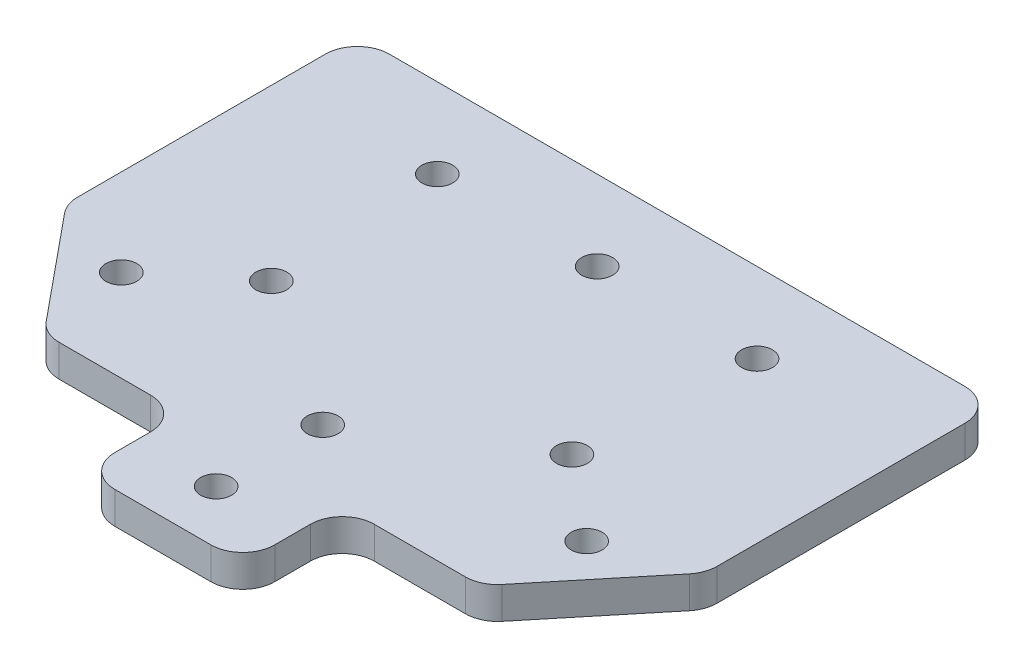
ISO-10303-21;
HEADER;
FILE_DESCRIPTION(('STEP AP214'),'2;1');
FILE_NAME('part.step','',(''),(''),'','','');
FILE_SCHEMA(('AUTOMOTIVE_DESIGN { 1 0 10303 214 1 1 1 1 }'));
ENDSEC;
DATA;
#1=APPLICATION_CONTEXT('core data for automotive mechanical design processes');
#2=APPLICATION_PROTOCOL_DEFINITION('international standard','automotive_design',2000,#1);
#3=PRODUCT_CONTEXT('',#1,'mechanical');
#4=PRODUCT('Part','Part','',(#3));
#5=PRODUCT_RELATED_PRODUCT_CATEGORY('part','',(#4));
#6=PRODUCT_DEFINITION_FORMATION('','',#4);
#7=PRODUCT_DEFINITION_CONTEXT('part definition',#1,'design');
#8=PRODUCT_DEFINITION('design','',#6,#7);
#9=PRODUCT_DEFINITION_SHAPE('','',#8);
#10=(LENGTH_UNIT() NAMED_UNIT(*) SI_UNIT(.MILLI.,.METRE.));
#11=(NAMED_UNIT(*) PLANE_ANGLE_UNIT() SI_UNIT($,.RADIAN.));
#12=(NAMED_UNIT(*) SI_UNIT($,.STERADIAN.) SOLID_ANGLE_UNIT());
#13=UNCERTAINTY_MEASURE_WITH_UNIT(LENGTH_MEASURE(1.E-05),#10,'distance_accuracy_value','');
#14=(GEOMETRIC_REPRESENTATION_CONTEXT(3) GLOBAL_UNCERTAINTY_ASSIGNED_CONTEXT((#13)) GLOBAL_UNIT_ASSIGNED_CONTEXT((#10,
#11,#12)) REPRESENTATION_CONTEXT('',''));
#15=CARTESIAN_POINT('',(0.,0.,0.));
#16=DIRECTION('',(0.,0.,1.));
#17=DIRECTION('',(1.,0.,0.));
#18=AXIS2_PLACEMENT_3D('',#15,#16,#17);
#19=CARTESIAN_POINT('',(0.,3.,0.));
#20=DIRECTION('',(0.,1.,0.));
#21=DIRECTION('',(0.,0.,1.));
#22=AXIS2_PLACEMENT_3D('',#19,#20,#21);
#23=PLANE('',#22);
#24=CARTESIAN_POINT('',(0.,3.,-131.748929431074));
#25=DIRECTION('',(0.,1.,0.));
#26=DIRECTION('',(0.,0.,1.));
#27=AXIS2_PLACEMENT_3D('',#24,#25,#26);
#28=CIRCLE('',#27,1.45);
#29=CARTESIAN_POINT('',(0.,3.,-130.298929431074));
#30=VERTEX_POINT('',#29);
#31=EDGE_CURVE('E536',#30,#30,#28,.T.);
#32=ORIENTED_EDGE('',*,*,#31,.F.);
#33=EDGE_LOOP('',(#32));
#34=FACE_BOUND('',#33,.T.);
#35=CARTESIAN_POINT('',(14.1030999850787,3.,-141.030854535507));
#36=DIRECTION('',(0.,1.,0.));
#37=DIRECTION('',(0.,0.,-1.));
#38=AXIS2_PLACEMENT_3D('',#35,#36,#37);
#39=CIRCLE('',#38,1.45000000000003);
#40=CARTESIAN_POINT('',(14.1030999850787,3.,-142.480854535507));
#41=VERTEX_POINT('',#40);
#42=EDGE_CURVE('E524',#41,#41,#39,.T.);
#43=ORIENTED_EDGE('',*,*,#42,.F.);
#44=EDGE_LOOP('',(#43));
#45=FACE_BOUND('',#44,.T.);
#46=CARTESIAN_POINT('',(-21.8303727123515,3.,-134.68347269743));
#47=DIRECTION('',(0.,1.,0.));
#48=DIRECTION('',(0.,0.,1.));
#49=AXIS2_PLACEMENT_3D('',#46,#47,#48);
#50=CIRCLE('',#49,1.45);
#51=CARTESIAN_POINT('',(-21.8303727123515,3.,-133.23347269743));
#52=VERTEX_POINT('',#51);
#53=EDGE_CURVE('E512',#52,#52,#50,.T.);
#54=ORIENTED_EDGE('',*,*,#53,.F.);
#55=EDGE_LOOP('',(#54));
#56=FACE_BOUND('',#55,.T.);
#57=CARTESIAN_POINT('',(-15.,3.,-157.5));
#58=DIRECTION('',(0.,1.,0.));
#59=DIRECTION('',(0.,0.,1.));
#60=AXIS2_PLACEMENT_3D('',#57,#58,#59);
#61=CIRCLE('',#60,1.45000000000001);
#62=CARTESIAN_POINT('',(-15.,3.,-156.05));
#63=VERTEX_POINT('',#62);
#64=EDGE_CURVE('E501',#63,#63,#61,.T.);
#65=ORIENTED_EDGE('',*,*,#64,.F.);
#66=EDGE_LOOP('',(#65));
#67=FACE_BOUND('',#66,.T.);
#68=DIRECTION('',(-1.,0.,0.));
#69=VECTOR('',#68,1.);
#70=CARTESIAN_POINT('',(30.,3.,-165.));
#71=LINE('',#70,#69);
#72=CARTESIAN_POINT('',(27.,3.,-165.));
#73=VERTEX_POINT('',#72);
#74=CARTESIAN_POINT('',(-27.,3.,-165.));
#75=VERTEX_POINT('',#74);
#76=EDGE_CURVE('E216',#73,#75,#71,.T.);
#77=ORIENTED_EDGE('',*,*,#76,.T.);
#78=CARTESIAN_POINT('',(-27.,3.,-162.));
#79=DIRECTION('',(0.,1.,0.));
#80=DIRECTION('',(0.,0.,1.));
#81=AXIS2_PLACEMENT_3D('',#78,#79,#80);
#82=CIRCLE('',#81,3.);
#83=CARTESIAN_POINT('',(-30.,3.,-162.));
#84=VERTEX_POINT('',#83);
#85=EDGE_CURVE('E269',#75,#84,#82,.T.);
#86=ORIENTED_EDGE('',*,*,#85,.T.);
#87=DIRECTION('',(0.,0.,1.));
#88=VECTOR('',#87,1.);
#89=CARTESIAN_POINT('',(-30.,3.,-165.));
#90=LINE('',#89,#88);
#91=CARTESIAN_POINT('',(-30.,3.,-138.752784037145));
#92=VERTEX_POINT('',#91);
#93=EDGE_CURVE('E199',#84,#92,#90,.T.);
#94=ORIENTED_EDGE('',*,*,#93,.T.);
#95=CARTESIAN_POINT('',(-27.,3.,-138.752784037145));
#96=DIRECTION('',(0.,1.,0.));
#97=DIRECTION('',(0.,0.,1.));
#98=AXIS2_PLACEMENT_3D('',#95,#96,#97);
#99=CIRCLE('',#98,3.);
#100=CARTESIAN_POINT('',(-29.3181818181818,3.,-136.848569485722));
#101=VERTEX_POINT('',#100);
#102=EDGE_CURVE('E256',#92,#101,#99,.T.);
#103=ORIENTED_EDGE('',*,*,#102,.T.);
#104=DIRECTION('',(0.63473818380768,0.,0.772727272727272));
#105=VECTOR('',#104,1.);
#106=CARTESIAN_POINT('',(-30.,3.,-137.678611726086));
#107=LINE('',#106,#105);
#108=CARTESIAN_POINT('',(-21.3790337746728,3.,-127.183488083754));
#109=VERTEX_POINT('',#108);
#110=EDGE_CURVE('E339',#101,#109,#107,.T.);
#111=ORIENTED_EDGE('',*,*,#110,.T.);
#112=CARTESIAN_POINT('',(-19.0608519564909,3.,-129.087702635177));
#113=DIRECTION('',(0.,1.,0.));
#114=DIRECTION('',(0.,0.,1.));
#115=AXIS2_PLACEMENT_3D('',#112,#113,#114);
#116=CIRCLE('',#115,3.);
#117=CARTESIAN_POINT('',(-19.0608519564909,3.,-126.087702635177));
#118=VERTEX_POINT('',#117);
#119=EDGE_CURVE('E258',#109,#118,#116,.T.);
#120=ORIENTED_EDGE('',*,*,#119,.T.);
#121=DIRECTION('',(1.,0.,0.));
#122=VECTOR('',#121,1.);
#123=CARTESIAN_POINT('',(-20.4789272428847,3.,-126.087702635177));
#124=LINE('',#123,#122);
#125=CARTESIAN_POINT('',(-10.5,3.,-126.087702635177));
#126=VERTEX_POINT('',#125);
#127=EDGE_CURVE('E330',#118,#126,#124,.T.);
#128=ORIENTED_EDGE('',*,*,#127,.T.);
#129=CARTESIAN_POINT('',(-10.5,3.,-123.087702635177));
#130=DIRECTION('',(0.,1.,0.));
#131=DIRECTION('',(0.,0.,1.));
#132=AXIS2_PLACEMENT_3D('',#129,#130,#131);
#133=CIRCLE('',#132,3.);
#134=CARTESIAN_POINT('',(-7.49999999999999,3.,-123.087702635177));
#135=VERTEX_POINT('',#134);
#136=EDGE_CURVE('E11',#126,#135,#133,.F.);
#137=ORIENTED_EDGE('',*,*,#136,.T.);
#138=DIRECTION('',(0.,0.,1.));
#139=VECTOR('',#138,1.);
#140=CARTESIAN_POINT('',(-7.49999999999999,3.,-126.087702635177));
#141=LINE('',#140,#139);
#142=CARTESIAN_POINT('',(-7.49999999999999,3.,-119.748929431074));
#143=VERTEX_POINT('',#142);
#144=EDGE_CURVE('E328',#135,#143,#141,.T.);
#145=ORIENTED_EDGE('',*,*,#144,.T.);
#146=CARTESIAN_POINT('',(-4.49999999999999,3.,-119.748929431074));
#147=DIRECTION('',(0.,1.,0.));
#148=DIRECTION('',(0.,0.,1.));
#149=AXIS2_PLACEMENT_3D('',#146,#147,#148);
#150=CIRCLE('',#149,3.);
#151=CARTESIAN_POINT('',(-4.5,3.,-116.748929431074));
#152=VERTEX_POINT('',#151);
#153=EDGE_CURVE('E260',#143,#152,#150,.T.);
#154=ORIENTED_EDGE('',*,*,#153,.T.);
#155=DIRECTION('',(1.,0.,0.));
#156=VECTOR('',#155,1.);
#157=CARTESIAN_POINT('',(-7.49999999999999,3.,-116.748929431074));
#158=LINE('',#157,#156);
#159=CARTESIAN_POINT('',(4.50000000000001,3.,-116.748929431074));
#160=VERTEX_POINT('',#159);
#161=EDGE_CURVE('E334',#152,#160,#158,.T.);
#162=ORIENTED_EDGE('',*,*,#161,.T.);
#163=CARTESIAN_POINT('',(4.50000000000001,3.,-119.748929431074));
#164=DIRECTION('',(0.,1.,0.));
#165=DIRECTION('',(0.,0.,1.));
#166=AXIS2_PLACEMENT_3D('',#163,#164,#165);
#167=CIRCLE('',#166,3.);
#168=CARTESIAN_POINT('',(7.50000000000001,3.,-119.748929431074));
#169=VERTEX_POINT('',#168);
#170=EDGE_CURVE('E262',#160,#169,#167,.T.);
#171=ORIENTED_EDGE('',*,*,#170,.T.);
#172=DIRECTION('',(0.,0.,-1.));
#173=VECTOR('',#172,1.);
#174=CARTESIAN_POINT('',(7.50000000000001,3.,-116.748929431074));
#175=LINE('',#174,#173);
#176=CARTESIAN_POINT('',(7.50000000000001,3.,-123.087702635177));
#177=VERTEX_POINT('',#176);
#178=EDGE_CURVE('E337',#169,#177,#175,.T.);
#179=ORIENTED_EDGE('',*,*,#178,.T.);
#180=CARTESIAN_POINT('',(10.5,3.,-123.087702635177));
#181=DIRECTION('',(0.,1.,0.));
#182=DIRECTION('',(0.,0.,1.));
#183=AXIS2_PLACEMENT_3D('',#180,#181,#182);
#184=CIRCLE('',#183,3.);
#185=CARTESIAN_POINT('',(10.5,3.,-126.087702635177));
#186=VERTEX_POINT('',#185);
#187=EDGE_CURVE('E312',#177,#186,#184,.F.);
#188=ORIENTED_EDGE('',*,*,#187,.T.);
#189=DIRECTION('',(1.,0.,0.));
#190=VECTOR('',#189,1.);
#191=CARTESIAN_POINT('',(7.50000000000001,3.,-126.087702635177));
#192=LINE('',#191,#190);
#193=CARTESIAN_POINT('',(19.060851956491,3.,-126.087702635177));
#194=VERTEX_POINT('',#193);
#195=EDGE_CURVE('E345',#186,#194,#192,.T.);
#196=ORIENTED_EDGE('',*,*,#195,.T.);
#197=CARTESIAN_POINT('',(19.060851956491,3.,-129.087702635177));
#198=DIRECTION('',(0.,1.,0.));
#199=DIRECTION('',(0.,0.,1.));
#200=AXIS2_PLACEMENT_3D('',#197,#198,#199);
#201=CIRCLE('',#200,3.);
#202=CARTESIAN_POINT('',(21.3790337746728,3.,-127.183488083754));
#203=VERTEX_POINT('',#202);
#204=EDGE_CURVE('E264',#194,#203,#201,.T.);
#205=ORIENTED_EDGE('',*,*,#204,.T.);
#206=DIRECTION('',(0.63473818380768,0.,-0.772727272727272));
#207=VECTOR('',#206,1.);
#208=CARTESIAN_POINT('',(20.4789272428847,3.,-126.087702635177));
#209=LINE('',#208,#207);
#210=CARTESIAN_POINT('',(29.3181818181818,3.,-136.848569485722));
#211=VERTEX_POINT('',#210);
#212=EDGE_CURVE('E348',#203,#211,#209,.T.);
#213=ORIENTED_EDGE('',*,*,#212,.T.);
#214=CARTESIAN_POINT('',(27.,3.,-138.752784037145));
#215=DIRECTION('',(0.,1.,0.));
#216=DIRECTION('',(0.,0.,1.));
#217=AXIS2_PLACEMENT_3D('',#214,#215,#216);
#218=CIRCLE('',#217,3.);
#219=CARTESIAN_POINT('',(30.,3.,-138.752784037145));
#220=VERTEX_POINT('',#219);
#221=EDGE_CURVE('E63',#211,#220,#218,.T.);
#222=ORIENTED_EDGE('',*,*,#221,.T.);
#223=DIRECTION('',(0.,0.,-1.));
#224=VECTOR('',#223,1.);
#225=CARTESIAN_POINT('',(30.,3.,-137.678611726086));
#226=LINE('',#225,#224);
#227=CARTESIAN_POINT('',(30.,3.,-162.));
#228=VERTEX_POINT('',#227);
#229=EDGE_CURVE('E349',#220,#228,#226,.T.);
#230=ORIENTED_EDGE('',*,*,#229,.T.);
#231=CARTESIAN_POINT('',(27.,3.,-162.));
#232=DIRECTION('',(0.,1.,0.));
#233=DIRECTION('',(0.,0.,1.));
#234=AXIS2_PLACEMENT_3D('',#231,#232,#233);
#235=CIRCLE('',#234,3.);
#236=EDGE_CURVE('E267',#228,#73,#235,.T.);
#237=ORIENTED_EDGE('',*,*,#236,.T.);
#238=EDGE_LOOP('',(#77,#86,#94,#103,#111,#120,#128,#137,#145,#154,#162,#171,#179,#188,#196,#205,
#213,#222,#230,#237));
#239=FACE_BOUND('',#238,.T.);
#240=CARTESIAN_POINT('',(0.,3.,-157.5));
#241=DIRECTION('',(0.,1.,0.));
#242=DIRECTION('',(0.,0.,1.));
#243=AXIS2_PLACEMENT_3D('',#240,#241,#242);
#244=CIRCLE('',#243,1.45000000000001);
#245=CARTESIAN_POINT('',(0.,3.,-156.05));
#246=VERTEX_POINT('',#245);
#247=EDGE_CURVE('E207',#246,#246,#244,.T.);
#248=ORIENTED_EDGE('',*,*,#247,.F.);
#249=EDGE_LOOP('',(#248));
#250=FACE_BOUND('',#249,.T.);
#251=CARTESIAN_POINT('',(-14.1030999850787,3.,-141.030854535507));
#252=DIRECTION('',(0.,1.,0.));
#253=DIRECTION('',(0.,0.,1.));
#254=AXIS2_PLACEMENT_3D('',#251,#252,#253);
#255=CIRCLE('',#254,1.45000000000002);
#256=CARTESIAN_POINT('',(-14.1030999850787,3.,-139.580854535507));
#257=VERTEX_POINT('',#256);
#258=EDGE_CURVE('E506',#257,#257,#255,.T.);
#259=ORIENTED_EDGE('',*,*,#258,.F.);
#260=EDGE_LOOP('',(#259));
#261=FACE_BOUND('',#260,.T.);
#262=CARTESIAN_POINT('',(21.8303727123515,3.,-134.68347269743));
#263=DIRECTION('',(0.,1.,0.));
#264=DIRECTION('',(0.,0.,-1.));
#265=AXIS2_PLACEMENT_3D('',#262,#263,#264);
#266=CIRCLE('',#265,1.45000000000002);
#267=CARTESIAN_POINT('',(21.8303727123515,3.,-136.13347269743));
#268=VERTEX_POINT('',#267);
#269=EDGE_CURVE('E518',#268,#268,#266,.T.);
#270=ORIENTED_EDGE('',*,*,#269,.F.);
#271=EDGE_LOOP('',(#270));
#272=FACE_BOUND('',#271,.T.);
#273=CARTESIAN_POINT('',(15.,3.,-157.5));
#274=DIRECTION('',(0.,1.,0.));
#275=DIRECTION('',(0.,0.,-1.));
#276=AXIS2_PLACEMENT_3D('',#273,#274,#275);
#277=CIRCLE('',#276,1.45000000000001);
#278=CARTESIAN_POINT('',(15.,3.,-158.95));
#279=VERTEX_POINT('',#278);
#280=EDGE_CURVE('E530',#279,#279,#277,.T.);
#281=ORIENTED_EDGE('',*,*,#280,.F.);
#282=EDGE_LOOP('',(#281));
#283=FACE_BOUND('',#282,.T.);
#284=CARTESIAN_POINT('',(0.,3.,-121.748929431074));
#285=DIRECTION('',(0.,1.,0.));
#286=DIRECTION('',(0.,0.,1.));
#287=AXIS2_PLACEMENT_3D('',#284,#285,#286);
#288=CIRCLE('',#287,1.45000000000001);
#289=CARTESIAN_POINT('',(0.,3.,-120.298929431074));
#290=VERTEX_POINT('',#289);
#291=EDGE_CURVE('E542',#290,#290,#288,.T.);
#292=ORIENTED_EDGE('',*,*,#291,.F.);
#293=EDGE_LOOP('',(#292));
#294=FACE_BOUND('',#293,.T.);
#295=ADVANCED_FACE('F41',(#34,#45,#56,#67,#239,#250,#261,#272,#283,#294),#23,.T.);
#296=CARTESIAN_POINT('',(0.,0.,0.));
#297=DIRECTION('',(0.,1.,0.));
#298=DIRECTION('',(0.,0.,1.));
#299=AXIS2_PLACEMENT_3D('',#296,#297,#298);
#300=PLANE('',#299);
#301=DIRECTION('',(0.,0.,1.));
#302=VECTOR('',#301,1.);
#303=CARTESIAN_POINT('',(-30.,0.,-165.));
#304=LINE('',#303,#302);
#305=CARTESIAN_POINT('',(-30.,0.,-162.));
#306=VERTEX_POINT('',#305);
#307=CARTESIAN_POINT('',(-30.,0.,-138.752784037145));
#308=VERTEX_POINT('',#307);
#309=EDGE_CURVE('E196',#306,#308,#304,.T.);
#310=ORIENTED_EDGE('',*,*,#309,.F.);
#311=CARTESIAN_POINT('',(-27.,0.,-162.));
#312=DIRECTION('',(0.,1.,0.));
#313=DIRECTION('',(0.,0.,1.));
#314=AXIS2_PLACEMENT_3D('',#311,#312,#313);
#315=CIRCLE('',#314,3.);
#316=CARTESIAN_POINT('',(-27.,0.,-165.));
#317=VERTEX_POINT('',#316);
#318=EDGE_CURVE('E179',#306,#317,#315,.F.);
#319=ORIENTED_EDGE('',*,*,#318,.T.);
#320=DIRECTION('',(-1.,0.,0.));
#321=VECTOR('',#320,1.);
#322=CARTESIAN_POINT('',(30.,0.,-165.));
#323=LINE('',#322,#321);
#324=CARTESIAN_POINT('',(27.,0.,-165.));
#325=VERTEX_POINT('',#324);
#326=EDGE_CURVE('E238',#325,#317,#323,.T.);
#327=ORIENTED_EDGE('',*,*,#326,.F.);
#328=CARTESIAN_POINT('',(27.,0.,-162.));
#329=DIRECTION('',(0.,1.,0.));
#330=DIRECTION('',(0.,0.,1.));
#331=AXIS2_PLACEMENT_3D('',#328,#329,#330);
#332=CIRCLE('',#331,3.);
#333=CARTESIAN_POINT('',(30.,0.,-162.));
#334=VERTEX_POINT('',#333);
#335=EDGE_CURVE('E190',#325,#334,#332,.F.);
#336=ORIENTED_EDGE('',*,*,#335,.T.);
#337=DIRECTION('',(0.,0.,-1.));
#338=VECTOR('',#337,1.);
#339=CARTESIAN_POINT('',(30.,0.,-137.678611726086));
#340=LINE('',#339,#338);
#341=CARTESIAN_POINT('',(30.,0.,-138.752784037145));
#342=VERTEX_POINT('',#341);
#343=EDGE_CURVE('E236',#342,#334,#340,.T.);
#344=ORIENTED_EDGE('',*,*,#343,.F.);
#345=CARTESIAN_POINT('',(27.,0.,-138.752784037145));
#346=DIRECTION('',(0.,1.,0.));
#347=DIRECTION('',(0.,0.,1.));
#348=AXIS2_PLACEMENT_3D('',#345,#346,#347);
#349=CIRCLE('',#348,3.);
#350=CARTESIAN_POINT('',(29.3181818181818,0.,-136.848569485722));
#351=VERTEX_POINT('',#350);
#352=EDGE_CURVE('E250',#342,#351,#349,.F.);
#353=ORIENTED_EDGE('',*,*,#352,.T.);
#354=DIRECTION('',(0.63473818380768,0.,-0.772727272727272));
#355=VECTOR('',#354,1.);
#356=CARTESIAN_POINT('',(20.4789272428847,0.,-126.087702635177));
#357=LINE('',#356,#355);
#358=CARTESIAN_POINT('',(21.3790337746728,0.,-127.183488083754));
#359=VERTEX_POINT('',#358);
#360=EDGE_CURVE('E233',#359,#351,#357,.T.);
#361=ORIENTED_EDGE('',*,*,#360,.F.);
#362=CARTESIAN_POINT('',(19.060851956491,0.,-129.087702635177));
#363=DIRECTION('',(0.,1.,0.));
#364=DIRECTION('',(0.,0.,1.));
#365=AXIS2_PLACEMENT_3D('',#362,#363,#364);
#366=CIRCLE('',#365,3.);
#367=CARTESIAN_POINT('',(19.060851956491,0.,-126.087702635177));
#368=VERTEX_POINT('',#367);
#369=EDGE_CURVE('E248',#359,#368,#366,.F.);
#370=ORIENTED_EDGE('',*,*,#369,.T.);
#371=DIRECTION('',(1.,0.,0.));
#372=VECTOR('',#371,1.);
#373=CARTESIAN_POINT('',(7.50000000000001,0.,-126.087702635177));
#374=LINE('',#373,#372);
#375=CARTESIAN_POINT('',(10.5,0.,-126.087702635177));
#376=VERTEX_POINT('',#375);
#377=EDGE_CURVE('E230',#376,#368,#374,.T.);
#378=ORIENTED_EDGE('',*,*,#377,.F.);
#379=CARTESIAN_POINT('',(10.5,0.,-123.087702635177));
#380=DIRECTION('',(0.,1.,0.));
#381=DIRECTION('',(0.,0.,1.));
#382=AXIS2_PLACEMENT_3D('',#379,#380,#381);
#383=CIRCLE('',#382,3.);
#384=CARTESIAN_POINT('',(7.50000000000001,0.,-123.087702635177));
#385=VERTEX_POINT('',#384);
#386=EDGE_CURVE('E310',#376,#385,#383,.T.);
#387=ORIENTED_EDGE('',*,*,#386,.T.);
#388=DIRECTION('',(0.,0.,-1.));
#389=VECTOR('',#388,1.);
#390=CARTESIAN_POINT('',(7.50000000000001,0.,-116.748929431074));
#391=LINE('',#390,#389);
#392=CARTESIAN_POINT('',(7.50000000000001,0.,-119.748929431074));
#393=VERTEX_POINT('',#392);
#394=EDGE_CURVE('E227',#393,#385,#391,.T.);
#395=ORIENTED_EDGE('',*,*,#394,.F.);
#396=CARTESIAN_POINT('',(4.50000000000001,0.,-119.748929431074));
#397=DIRECTION('',(0.,1.,0.));
#398=DIRECTION('',(0.,0.,1.));
#399=AXIS2_PLACEMENT_3D('',#396,#397,#398);
#400=CIRCLE('',#399,3.);
#401=CARTESIAN_POINT('',(4.50000000000001,0.,-116.748929431074));
#402=VERTEX_POINT('',#401);
#403=EDGE_CURVE('E246',#393,#402,#400,.F.);
#404=ORIENTED_EDGE('',*,*,#403,.T.);
#405=DIRECTION('',(1.,0.,0.));
#406=VECTOR('',#405,1.);
#407=CARTESIAN_POINT('',(-7.49999999999999,0.,-116.748929431074));
#408=LINE('',#407,#406);
#409=CARTESIAN_POINT('',(-4.5,0.,-116.748929431074));
#410=VERTEX_POINT('',#409);
#411=EDGE_CURVE('E224',#410,#402,#408,.T.);
#412=ORIENTED_EDGE('',*,*,#411,.F.);
#413=CARTESIAN_POINT('',(-4.49999999999999,0.,-119.748929431074));
#414=DIRECTION('',(0.,1.,0.));
#415=DIRECTION('',(0.,0.,1.));
#416=AXIS2_PLACEMENT_3D('',#413,#414,#415);
#417=CIRCLE('',#416,3.);
#418=CARTESIAN_POINT('',(-7.49999999999999,0.,-119.748929431074));
#419=VERTEX_POINT('',#418);
#420=EDGE_CURVE('E244',#410,#419,#417,.F.);
#421=ORIENTED_EDGE('',*,*,#420,.T.);
#422=DIRECTION('',(0.,0.,1.));
#423=VECTOR('',#422,1.);
#424=CARTESIAN_POINT('',(-7.49999999999999,0.,-126.087702635177));
#425=LINE('',#424,#423);
#426=CARTESIAN_POINT('',(-7.49999999999999,0.,-123.087702635177));
#427=VERTEX_POINT('',#426);
#428=EDGE_CURVE('E221',#427,#419,#425,.T.);
#429=ORIENTED_EDGE('',*,*,#428,.F.);
#430=CARTESIAN_POINT('',(-10.5,0.,-123.087702635177));
#431=DIRECTION('',(0.,1.,0.));
#432=DIRECTION('',(0.,0.,1.));
#433=AXIS2_PLACEMENT_3D('',#430,#431,#432);
#434=CIRCLE('',#433,3.);
#435=CARTESIAN_POINT('',(-10.5,0.,-126.087702635177));
#436=VERTEX_POINT('',#435);
#437=EDGE_CURVE('E49',#427,#436,#434,.T.);
#438=ORIENTED_EDGE('',*,*,#437,.T.);
#439=DIRECTION('',(1.,0.,0.));
#440=VECTOR('',#439,1.);
#441=CARTESIAN_POINT('',(-20.4789272428847,0.,-126.087702635177));
#442=LINE('',#441,#440);
#443=CARTESIAN_POINT('',(-19.0608519564909,0.,-126.087702635177));
#444=VERTEX_POINT('',#443);
#445=EDGE_CURVE('E210',#444,#436,#442,.T.);
#446=ORIENTED_EDGE('',*,*,#445,.F.);
#447=CARTESIAN_POINT('',(-19.0608519564909,0.,-129.087702635177));
#448=DIRECTION('',(0.,1.,0.));
#449=DIRECTION('',(0.,0.,1.));
#450=AXIS2_PLACEMENT_3D('',#447,#448,#449);
#451=CIRCLE('',#450,3.);
#452=CARTESIAN_POINT('',(-21.3790337746728,0.,-127.183488083754));
#453=VERTEX_POINT('',#452);
#454=EDGE_CURVE('E242',#444,#453,#451,.F.);
#455=ORIENTED_EDGE('',*,*,#454,.T.);
#456=DIRECTION('',(0.63473818380768,0.,0.772727272727272));
#457=VECTOR('',#456,1.);
#458=CARTESIAN_POINT('',(-30.,0.,-137.678611726086));
#459=LINE('',#458,#457);
#460=CARTESIAN_POINT('',(-29.3181818181818,0.,-136.848569485722));
#461=VERTEX_POINT('',#460);
#462=EDGE_CURVE('E206',#461,#453,#459,.T.);
#463=ORIENTED_EDGE('',*,*,#462,.F.);
#464=CARTESIAN_POINT('',(-27.,0.,-138.752784037145));
#465=DIRECTION('',(0.,1.,0.));
#466=DIRECTION('',(0.,0.,1.));
#467=AXIS2_PLACEMENT_3D('',#464,#465,#466);
#468=CIRCLE('',#467,3.);
#469=EDGE_CURVE('E200',#461,#308,#468,.F.);
#470=ORIENTED_EDGE('',*,*,#469,.T.);
#471=EDGE_LOOP('',(#310,#319,#327,#336,#344,#353,#361,#370,#378,#387,#395,#404,#412,#421,#429,
#438,#446,#455,#463,#470));
#472=FACE_BOUND('',#471,.T.);
#473=CARTESIAN_POINT('',(0.,0.,-157.5));
#474=DIRECTION('',(0.,1.,0.));
#475=DIRECTION('',(0.,0.,1.));
#476=AXIS2_PLACEMENT_3D('',#473,#474,#475);
#477=CIRCLE('',#476,1.45000000000001);
#478=CARTESIAN_POINT('',(0.,0.,-156.05));
#479=VERTEX_POINT('',#478);
#480=EDGE_CURVE('E213',#479,#479,#477,.T.);
#481=ORIENTED_EDGE('',*,*,#480,.T.);
#482=EDGE_LOOP('',(#481));
#483=FACE_BOUND('',#482,.T.);
#484=CARTESIAN_POINT('',(-15.,0.,-157.5));
#485=DIRECTION('',(0.,1.,0.));
#486=DIRECTION('',(0.,0.,1.));
#487=AXIS2_PLACEMENT_3D('',#484,#485,#486);
#488=CIRCLE('',#487,1.45000000000001);
#489=CARTESIAN_POINT('',(-15.,0.,-156.05));
#490=VERTEX_POINT('',#489);
#491=EDGE_CURVE('E503',#490,#490,#488,.T.);
#492=ORIENTED_EDGE('',*,*,#491,.T.);
#493=EDGE_LOOP('',(#492));
#494=FACE_BOUND('',#493,.T.);
#495=CARTESIAN_POINT('',(-14.1030999850787,0.,-141.030854535507));
#496=DIRECTION('',(0.,1.,0.));
#497=DIRECTION('',(0.,0.,1.));
#498=AXIS2_PLACEMENT_3D('',#495,#496,#497);
#499=CIRCLE('',#498,1.45000000000002);
#500=CARTESIAN_POINT('',(-14.1030999850787,0.,-139.580854535507));
#501=VERTEX_POINT('',#500);
#502=EDGE_CURVE('E509',#501,#501,#499,.T.);
#503=ORIENTED_EDGE('',*,*,#502,.T.);
#504=EDGE_LOOP('',(#503));
#505=FACE_BOUND('',#504,.T.);
#506=CARTESIAN_POINT('',(-21.8303727123515,0.,-134.68347269743));
#507=DIRECTION('',(0.,1.,0.));
#508=DIRECTION('',(0.,0.,1.));
#509=AXIS2_PLACEMENT_3D('',#506,#507,#508);
#510=CIRCLE('',#509,1.45);
#511=CARTESIAN_POINT('',(-21.8303727123515,0.,-133.23347269743));
#512=VERTEX_POINT('',#511);
#513=EDGE_CURVE('E515',#512,#512,#510,.T.);
#514=ORIENTED_EDGE('',*,*,#513,.T.);
#515=EDGE_LOOP('',(#514));
#516=FACE_BOUND('',#515,.T.);
#517=CARTESIAN_POINT('',(21.8303727123515,0.,-134.68347269743));
#518=DIRECTION('',(0.,1.,0.));
#519=DIRECTION('',(0.,0.,-1.));
#520=AXIS2_PLACEMENT_3D('',#517,#518,#519);
#521=CIRCLE('',#520,1.45000000000002);
#522=CARTESIAN_POINT('',(21.8303727123515,0.,-136.13347269743));
#523=VERTEX_POINT('',#522);
#524=EDGE_CURVE('E521',#523,#523,#521,.T.);
#525=ORIENTED_EDGE('',*,*,#524,.T.);
#526=EDGE_LOOP('',(#525));
#527=FACE_BOUND('',#526,.T.);
#528=CARTESIAN_POINT('',(14.1030999850787,0.,-141.030854535507));
#529=DIRECTION('',(0.,1.,0.));
#530=DIRECTION('',(0.,0.,-1.));
#531=AXIS2_PLACEMENT_3D('',#528,#529,#530);
#532=CIRCLE('',#531,1.45000000000003);
#533=CARTESIAN_POINT('',(14.1030999850787,0.,-142.480854535507));
#534=VERTEX_POINT('',#533);
#535=EDGE_CURVE('E527',#534,#534,#532,.T.);
#536=ORIENTED_EDGE('',*,*,#535,.T.);
#537=EDGE_LOOP('',(#536));
#538=FACE_BOUND('',#537,.T.);
#539=CARTESIAN_POINT('',(15.,0.,-157.5));
#540=DIRECTION('',(0.,1.,0.));
#541=DIRECTION('',(0.,0.,-1.));
#542=AXIS2_PLACEMENT_3D('',#539,#540,#541);
#543=CIRCLE('',#542,1.45000000000001);
#544=CARTESIAN_POINT('',(15.,0.,-158.95));
#545=VERTEX_POINT('',#544);
#546=EDGE_CURVE('E533',#545,#545,#543,.T.);
#547=ORIENTED_EDGE('',*,*,#546,.T.);
#548=EDGE_LOOP('',(#547));
#549=FACE_BOUND('',#548,.T.);
#550=CARTESIAN_POINT('',(0.,0.,-131.748929431074));
#551=DIRECTION('',(0.,1.,0.));
#552=DIRECTION('',(0.,0.,1.));
#553=AXIS2_PLACEMENT_3D('',#550,#551,#552);
#554=CIRCLE('',#553,1.45);
#555=CARTESIAN_POINT('',(0.,0.,-130.298929431074));
#556=VERTEX_POINT('',#555);
#557=EDGE_CURVE('E539',#556,#556,#554,.T.);
#558=ORIENTED_EDGE('',*,*,#557,.T.);
#559=EDGE_LOOP('',(#558));
#560=FACE_BOUND('',#559,.T.);
#561=CARTESIAN_POINT('',(0.,0.,-121.748929431074));
#562=DIRECTION('',(0.,1.,0.));
#563=DIRECTION('',(0.,0.,1.));
#564=AXIS2_PLACEMENT_3D('',#561,#562,#563);
#565=CIRCLE('',#564,1.45000000000001);
#566=CARTESIAN_POINT('',(0.,0.,-120.298929431074));
#567=VERTEX_POINT('',#566);
#568=EDGE_CURVE('E545',#567,#567,#565,.T.);
#569=ORIENTED_EDGE('',*,*,#568,.T.);
#570=EDGE_LOOP('',(#569));
#571=FACE_BOUND('',#570,.T.);
#572=ADVANCED_FACE('F203',(#472,#483,#494,#505,#516,#527,#538,#549,#560,#571),#300,.F.);
#573=CARTESIAN_POINT('',(-30.,3.,-165.));
#574=DIRECTION('',(1.,0.,0.));
#575=DIRECTION('',(0.,0.,-1.));
#576=AXIS2_PLACEMENT_3D('',#573,#574,#575);
#577=PLANE('',#576);
#578=ORIENTED_EDGE('',*,*,#93,.F.);
#579=DIRECTION('',(0.,-1.,0.));
#580=VECTOR('',#579,1.);
#581=CARTESIAN_POINT('',(-30.,3.,-162.));
#582=LINE('',#581,#580);
#583=EDGE_CURVE('E183',#84,#306,#582,.T.);
#584=ORIENTED_EDGE('',*,*,#583,.T.);
#585=ORIENTED_EDGE('',*,*,#309,.T.);
#586=DIRECTION('',(0.,-1.,0.));
#587=VECTOR('',#586,1.);
#588=CARTESIAN_POINT('',(-30.,3.,-138.752784037145));
#589=LINE('',#588,#587);
#590=EDGE_CURVE('E201',#308,#92,#589,.F.);
#591=ORIENTED_EDGE('',*,*,#590,.T.);
#592=EDGE_LOOP('',(#578,#584,#585,#591));
#593=FACE_BOUND('',#592,.T.);
#594=ADVANCED_FACE('F195',(#593),#577,.F.);
#595=CARTESIAN_POINT('',(-30.,3.,-137.678611726086));
#596=DIRECTION('',(0.772727272727272,0.,-0.63473818380768));
#597=DIRECTION('',(-0.63473818380768,0.,-0.772727272727272));
#598=AXIS2_PLACEMENT_3D('',#595,#596,#597);
#599=PLANE('',#598);
#600=ORIENTED_EDGE('',*,*,#462,.T.);
#601=DIRECTION('',(0.,-1.,0.));
#602=VECTOR('',#601,1.);
#603=CARTESIAN_POINT('',(-21.3790337746728,3.,-127.183488083754));
#604=LINE('',#603,#602);
#605=EDGE_CURVE('E308',#453,#109,#604,.F.);
#606=ORIENTED_EDGE('',*,*,#605,.T.);
#607=ORIENTED_EDGE('',*,*,#110,.F.);
#608=DIRECTION('',(0.,-1.,0.));
#609=VECTOR('',#608,1.);
#610=CARTESIAN_POINT('',(-29.3181818181818,3.,-136.848569485722));
#611=LINE('',#610,#609);
#612=EDGE_CURVE('E305',#101,#461,#611,.T.);
#613=ORIENTED_EDGE('',*,*,#612,.T.);
#614=EDGE_LOOP('',(#600,#606,#607,#613));
#615=FACE_BOUND('',#614,.T.);
#616=ADVANCED_FACE('F438',(#615),#599,.F.);
#617=CARTESIAN_POINT('',(-20.4789272428847,3.,-126.087702635177));
#618=DIRECTION('',(0.,0.,-1.));
#619=DIRECTION('',(-1.,0.,0.));
#620=AXIS2_PLACEMENT_3D('',#617,#618,#619);
#621=PLANE('',#620);
#622=ORIENTED_EDGE('',*,*,#127,.F.);
#623=DIRECTION('',(0.,-1.,0.));
#624=VECTOR('',#623,1.);
#625=CARTESIAN_POINT('',(-19.0608519564909,3.,-126.087702635177));
#626=LINE('',#625,#624);
#627=EDGE_CURVE('E302',#118,#444,#626,.T.);
#628=ORIENTED_EDGE('',*,*,#627,.T.);
#629=ORIENTED_EDGE('',*,*,#445,.T.);
#630=DIRECTION('',(0.,-1.,0.));
#631=VECTOR('',#630,1.);
#632=CARTESIAN_POINT('',(-10.5,3.,-126.087702635177));
#633=LINE('',#632,#631);
#634=EDGE_CURVE('E300',#436,#126,#633,.F.);
#635=ORIENTED_EDGE('',*,*,#634,.T.);
#636=EDGE_LOOP('',(#622,#628,#629,#635));
#637=FACE_BOUND('',#636,.T.);
#638=ADVANCED_FACE('F320',(#637),#621,.F.);
#639=CARTESIAN_POINT('',(-7.49999999999999,3.,-126.087702635177));
#640=DIRECTION('',(1.,0.,0.));
#641=DIRECTION('',(0.,0.,-1.));
#642=AXIS2_PLACEMENT_3D('',#639,#640,#641);
#643=PLANE('',#642);
#644=ORIENTED_EDGE('',*,*,#428,.T.);
#645=DIRECTION('',(0.,-1.,0.));
#646=VECTOR('',#645,1.);
#647=CARTESIAN_POINT('',(-7.49999999999999,3.,-119.748929431074));
#648=LINE('',#647,#646);
#649=EDGE_CURVE('E298',#419,#143,#648,.F.);
#650=ORIENTED_EDGE('',*,*,#649,.T.);
#651=ORIENTED_EDGE('',*,*,#144,.F.);
#652=DIRECTION('',(0.,-1.,0.));
#653=VECTOR('',#652,1.);
#654=CARTESIAN_POINT('',(-7.49999999999999,0.,-123.087702635177));
#655=LINE('',#654,#653);
#656=EDGE_CURVE('E295',#135,#427,#655,.T.);
#657=ORIENTED_EDGE('',*,*,#656,.T.);
#658=EDGE_LOOP('',(#644,#650,#651,#657));
#659=FACE_BOUND('',#658,.T.);
#660=ADVANCED_FACE('F332',(#659),#643,.F.);
#661=CARTESIAN_POINT('',(-7.49999999999999,3.,-116.748929431074));
#662=DIRECTION('',(0.,0.,-1.));
#663=DIRECTION('',(-1.,0.,0.));
#664=AXIS2_PLACEMENT_3D('',#661,#662,#663);
#665=PLANE('',#664);
#666=ORIENTED_EDGE('',*,*,#411,.T.);
#667=DIRECTION('',(0.,-1.,0.));
#668=VECTOR('',#667,1.);
#669=CARTESIAN_POINT('',(4.50000000000001,3.,-116.748929431074));
#670=LINE('',#669,#668);
#671=EDGE_CURVE('E293',#402,#160,#670,.F.);
#672=ORIENTED_EDGE('',*,*,#671,.T.);
#673=ORIENTED_EDGE('',*,*,#161,.F.);
#674=DIRECTION('',(0.,-1.,0.));
#675=VECTOR('',#674,1.);
#676=CARTESIAN_POINT('',(-4.5,3.,-116.748929431074));
#677=LINE('',#676,#675);
#678=EDGE_CURVE('E290',#152,#410,#677,.T.);
#679=ORIENTED_EDGE('',*,*,#678,.T.);
#680=EDGE_LOOP('',(#666,#672,#673,#679));
#681=FACE_BOUND('',#680,.T.);
#682=ADVANCED_FACE('F392',(#681),#665,.F.);
#683=CARTESIAN_POINT('',(7.50000000000001,3.,-116.748929431074));
#684=DIRECTION('',(-1.,0.,0.));
#685=DIRECTION('',(0.,0.,1.));
#686=AXIS2_PLACEMENT_3D('',#683,#684,#685);
#687=PLANE('',#686);
#688=ORIENTED_EDGE('',*,*,#394,.T.);
#689=DIRECTION('',(0.,-1.,0.));
#690=VECTOR('',#689,1.);
#691=CARTESIAN_POINT('',(7.50000000000001,3.,-123.087702635177));
#692=LINE('',#691,#690);
#693=EDGE_CURVE('E288',#385,#177,#692,.F.);
#694=ORIENTED_EDGE('',*,*,#693,.T.);
#695=ORIENTED_EDGE('',*,*,#178,.F.);
#696=DIRECTION('',(0.,-1.,0.));
#697=VECTOR('',#696,1.);
#698=CARTESIAN_POINT('',(7.50000000000001,3.,-119.748929431074));
#699=LINE('',#698,#697);
#700=EDGE_CURVE('E285',#169,#393,#699,.T.);
#701=ORIENTED_EDGE('',*,*,#700,.T.);
#702=EDGE_LOOP('',(#688,#694,#695,#701));
#703=FACE_BOUND('',#702,.T.);
#704=ADVANCED_FACE('F383',(#703),#687,.F.);
#705=CARTESIAN_POINT('',(7.50000000000001,3.,-126.087702635177));
#706=DIRECTION('',(0.,0.,-1.));
#707=DIRECTION('',(-1.,0.,0.));
#708=AXIS2_PLACEMENT_3D('',#705,#706,#707);
#709=PLANE('',#708);
#710=ORIENTED_EDGE('',*,*,#377,.T.);
#711=DIRECTION('',(0.,-1.,0.));
#712=VECTOR('',#711,1.);
#713=CARTESIAN_POINT('',(19.060851956491,3.,-126.087702635177));
#714=LINE('',#713,#712);
#715=EDGE_CURVE('E283',#368,#194,#714,.F.);
#716=ORIENTED_EDGE('',*,*,#715,.T.);
#717=ORIENTED_EDGE('',*,*,#195,.F.);
#718=DIRECTION('',(0.,-1.,0.));
#719=VECTOR('',#718,1.);
#720=CARTESIAN_POINT('',(10.5,0.,-126.087702635177));
#721=LINE('',#720,#719);
#722=EDGE_CURVE('E280',#186,#376,#721,.T.);
#723=ORIENTED_EDGE('',*,*,#722,.T.);
#724=EDGE_LOOP('',(#710,#716,#717,#723));
#725=FACE_BOUND('',#724,.T.);
#726=ADVANCED_FACE('F374',(#725),#709,.F.);
#727=CARTESIAN_POINT('',(20.4789272428847,3.,-126.087702635177));
#728=DIRECTION('',(-0.772727272727272,0.,-0.63473818380768));
#729=DIRECTION('',(-0.63473818380768,0.,0.772727272727272));
#730=AXIS2_PLACEMENT_3D('',#727,#728,#729);
#731=PLANE('',#730);
#732=ORIENTED_EDGE('',*,*,#360,.T.);
#733=DIRECTION('',(0.,-1.,0.));
#734=VECTOR('',#733,1.);
#735=CARTESIAN_POINT('',(29.3181818181818,3.,-136.848569485722));
#736=LINE('',#735,#734);
#737=EDGE_CURVE('E278',#351,#211,#736,.F.);
#738=ORIENTED_EDGE('',*,*,#737,.T.);
#739=ORIENTED_EDGE('',*,*,#212,.F.);
#740=DIRECTION('',(0.,-1.,0.));
#741=VECTOR('',#740,1.);
#742=CARTESIAN_POINT('',(21.3790337746728,3.,-127.183488083754));
#743=LINE('',#742,#741);
#744=EDGE_CURVE('E275',#203,#359,#743,.T.);
#745=ORIENTED_EDGE('',*,*,#744,.T.);
#746=EDGE_LOOP('',(#732,#738,#739,#745));
#747=FACE_BOUND('',#746,.T.);
#748=ADVANCED_FACE('F365',(#747),#731,.F.);
#749=CARTESIAN_POINT('',(30.,3.,-137.678611726086));
#750=DIRECTION('',(-1.,0.,0.));
#751=DIRECTION('',(0.,0.,1.));
#752=AXIS2_PLACEMENT_3D('',#749,#750,#751);
#753=PLANE('',#752);
#754=ORIENTED_EDGE('',*,*,#343,.T.);
#755=DIRECTION('',(0.,-1.,0.));
#756=VECTOR('',#755,1.);
#757=CARTESIAN_POINT('',(30.,3.,-162.));
#758=LINE('',#757,#756);
#759=EDGE_CURVE('E56',#334,#228,#758,.F.);
#760=ORIENTED_EDGE('',*,*,#759,.T.);
#761=ORIENTED_EDGE('',*,*,#229,.F.);
#762=DIRECTION('',(0.,-1.,0.));
#763=VECTOR('',#762,1.);
#764=CARTESIAN_POINT('',(30.,3.,-138.752784037145));
#765=LINE('',#764,#763);
#766=EDGE_CURVE('E271',#220,#342,#765,.T.);
#767=ORIENTED_EDGE('',*,*,#766,.T.);
#768=EDGE_LOOP('',(#754,#760,#761,#767));
#769=FACE_BOUND('',#768,.T.);
#770=ADVANCED_FACE('F358',(#769),#753,.F.);
#771=CARTESIAN_POINT('',(30.,3.,-165.));
#772=DIRECTION('',(0.,0.,1.));
#773=DIRECTION('',(1.,0.,0.));
#774=AXIS2_PLACEMENT_3D('',#771,#772,#773);
#775=PLANE('',#774);
#776=ORIENTED_EDGE('',*,*,#326,.T.);
#777=DIRECTION('',(0.,-1.,0.));
#778=VECTOR('',#777,1.);
#779=CARTESIAN_POINT('',(-27.,3.,-165.));
#780=LINE('',#779,#778);
#781=EDGE_CURVE('E184',#317,#75,#780,.F.);
#782=ORIENTED_EDGE('',*,*,#781,.T.);
#783=ORIENTED_EDGE('',*,*,#76,.F.);
#784=DIRECTION('',(0.,-1.,0.));
#785=VECTOR('',#784,1.);
#786=CARTESIAN_POINT('',(27.,3.,-165.));
#787=LINE('',#786,#785);
#788=EDGE_CURVE('E189',#73,#325,#787,.T.);
#789=ORIENTED_EDGE('',*,*,#788,.T.);
#790=EDGE_LOOP('',(#776,#782,#783,#789));
#791=FACE_BOUND('',#790,.T.);
#792=ADVANCED_FACE('F354',(#791),#775,.F.);
#793=CARTESIAN_POINT('',(0.,3.,-157.5));
#794=DIRECTION('',(0.,-1.,0.));
#795=DIRECTION('',(0.,0.,-1.));
#796=AXIS2_PLACEMENT_3D('',#793,#794,#795);
#797=CYLINDRICAL_SURFACE('',#796,1.45000000000001);
#798=ORIENTED_EDGE('',*,*,#247,.T.);
#799=EDGE_LOOP('',(#798));
#800=FACE_BOUND('',#799,.T.);
#801=ORIENTED_EDGE('',*,*,#480,.F.);
#802=EDGE_LOOP('',(#801));
#803=FACE_BOUND('',#802,.T.);
#804=ADVANCED_FACE('F419',(#800,#803),#797,.F.);
#805=CARTESIAN_POINT('',(-15.,3.,-157.5));
#806=DIRECTION('',(0.,-1.,0.));
#807=DIRECTION('',(0.,0.,-1.));
#808=AXIS2_PLACEMENT_3D('',#805,#806,#807);
#809=CYLINDRICAL_SURFACE('',#808,1.45000000000001);
#810=ORIENTED_EDGE('',*,*,#64,.T.);
#811=EDGE_LOOP('',(#810));
#812=FACE_BOUND('',#811,.T.);
#813=ORIENTED_EDGE('',*,*,#491,.F.);
#814=EDGE_LOOP('',(#813));
#815=FACE_BOUND('',#814,.T.);
#816=ADVANCED_FACE('F581',(#812,#815),#809,.F.);
#817=CARTESIAN_POINT('',(-14.1030999850787,3.,-141.030854535507));
#818=DIRECTION('',(0.,-1.,0.));
#819=DIRECTION('',(0.,0.,-1.));
#820=AXIS2_PLACEMENT_3D('',#817,#818,#819);
#821=CYLINDRICAL_SURFACE('',#820,1.45000000000002);
#822=ORIENTED_EDGE('',*,*,#258,.T.);
#823=EDGE_LOOP('',(#822));
#824=FACE_BOUND('',#823,.T.);
#825=ORIENTED_EDGE('',*,*,#502,.F.);
#826=EDGE_LOOP('',(#825));
#827=FACE_BOUND('',#826,.T.);
#828=ADVANCED_FACE('F578',(#824,#827),#821,.F.);
#829=CARTESIAN_POINT('',(-21.8303727123515,3.,-134.68347269743));
#830=DIRECTION('',(0.,-1.,0.));
#831=DIRECTION('',(0.,0.,-1.));
#832=AXIS2_PLACEMENT_3D('',#829,#830,#831);
#833=CYLINDRICAL_SURFACE('',#832,1.45);
#834=ORIENTED_EDGE('',*,*,#53,.T.);
#835=EDGE_LOOP('',(#834));
#836=FACE_BOUND('',#835,.T.);
#837=ORIENTED_EDGE('',*,*,#513,.F.);
#838=EDGE_LOOP('',(#837));
#839=FACE_BOUND('',#838,.T.);
#840=ADVANCED_FACE('F574',(#836,#839),#833,.F.);
#841=CARTESIAN_POINT('',(21.8303727123515,3.,-134.68347269743));
#842=DIRECTION('',(0.,-1.,0.));
#843=DIRECTION('',(0.,0.,-1.));
#844=AXIS2_PLACEMENT_3D('',#841,#842,#843);
#845=CYLINDRICAL_SURFACE('',#844,1.45000000000002);
#846=ORIENTED_EDGE('',*,*,#269,.T.);
#847=EDGE_LOOP('',(#846));
#848=FACE_BOUND('',#847,.T.);
#849=ORIENTED_EDGE('',*,*,#524,.F.);
#850=EDGE_LOOP('',(#849));
#851=FACE_BOUND('',#850,.T.);
#852=ADVANCED_FACE('F570',(#848,#851),#845,.F.);
#853=CARTESIAN_POINT('',(14.1030999850787,3.,-141.030854535507));
#854=DIRECTION('',(0.,-1.,0.));
#855=DIRECTION('',(0.,0.,-1.));
#856=AXIS2_PLACEMENT_3D('',#853,#854,#855);
#857=CYLINDRICAL_SURFACE('',#856,1.45000000000003);
#858=ORIENTED_EDGE('',*,*,#42,.T.);
#859=EDGE_LOOP('',(#858));
#860=FACE_BOUND('',#859,.T.);
#861=ORIENTED_EDGE('',*,*,#535,.F.);
#862=EDGE_LOOP('',(#861));
#863=FACE_BOUND('',#862,.T.);
#864=ADVANCED_FACE('F566',(#860,#863),#857,.F.);
#865=CARTESIAN_POINT('',(15.,3.,-157.5));
#866=DIRECTION('',(0.,-1.,0.));
#867=DIRECTION('',(0.,0.,-1.));
#868=AXIS2_PLACEMENT_3D('',#865,#866,#867);
#869=CYLINDRICAL_SURFACE('',#868,1.45000000000001);
#870=ORIENTED_EDGE('',*,*,#280,.T.);
#871=EDGE_LOOP('',(#870));
#872=FACE_BOUND('',#871,.T.);
#873=ORIENTED_EDGE('',*,*,#546,.F.);
#874=EDGE_LOOP('',(#873));
#875=FACE_BOUND('',#874,.T.);
#876=ADVANCED_FACE('F560',(#872,#875),#869,.F.);
#877=CARTESIAN_POINT('',(0.,3.,-131.748929431074));
#878=DIRECTION('',(0.,-1.,0.));
#879=DIRECTION('',(0.,0.,-1.));
#880=AXIS2_PLACEMENT_3D('',#877,#878,#879);
#881=CYLINDRICAL_SURFACE('',#880,1.45);
#882=ORIENTED_EDGE('',*,*,#31,.T.);
#883=EDGE_LOOP('',(#882));
#884=FACE_BOUND('',#883,.T.);
#885=ORIENTED_EDGE('',*,*,#557,.F.);
#886=EDGE_LOOP('',(#885));
#887=FACE_BOUND('',#886,.T.);
#888=ADVANCED_FACE('F553',(#884,#887),#881,.F.);
#889=CARTESIAN_POINT('',(0.,3.,-121.748929431074));
#890=DIRECTION('',(0.,-1.,0.));
#891=DIRECTION('',(0.,0.,-1.));
#892=AXIS2_PLACEMENT_3D('',#889,#890,#891);
#893=CYLINDRICAL_SURFACE('',#892,1.45000000000001);
#894=ORIENTED_EDGE('',*,*,#291,.T.);
#895=EDGE_LOOP('',(#894));
#896=FACE_BOUND('',#895,.T.);
#897=ORIENTED_EDGE('',*,*,#568,.F.);
#898=EDGE_LOOP('',(#897));
#899=FACE_BOUND('',#898,.T.);
#900=ADVANCED_FACE('F446',(#896,#899),#893,.F.);
#901=CARTESIAN_POINT('',(-27.,3.,-162.));
#902=DIRECTION('',(0.,-1.,0.));
#903=DIRECTION('',(0.,0.,-1.));
#904=AXIS2_PLACEMENT_3D('',#901,#902,#903);
#905=CYLINDRICAL_SURFACE('',#904,3.);
#906=ORIENTED_EDGE('',*,*,#85,.F.);
#907=ORIENTED_EDGE('',*,*,#781,.F.);
#908=ORIENTED_EDGE('',*,*,#318,.F.);
#909=ORIENTED_EDGE('',*,*,#583,.F.);
#910=EDGE_LOOP('',(#906,#907,#908,#909));
#911=FACE_BOUND('',#910,.T.);
#912=ADVANCED_FACE('F182',(#911),#905,.T.);
#913=CARTESIAN_POINT('',(27.,3.,-162.));
#914=DIRECTION('',(0.,-1.,0.));
#915=DIRECTION('',(0.,0.,-1.));
#916=AXIS2_PLACEMENT_3D('',#913,#914,#915);
#917=CYLINDRICAL_SURFACE('',#916,3.);
#918=ORIENTED_EDGE('',*,*,#236,.F.);
#919=ORIENTED_EDGE('',*,*,#759,.F.);
#920=ORIENTED_EDGE('',*,*,#335,.F.);
#921=ORIENTED_EDGE('',*,*,#788,.F.);
#922=EDGE_LOOP('',(#918,#919,#920,#921));
#923=FACE_BOUND('',#922,.T.);
#924=ADVANCED_FACE('F356',(#923),#917,.T.);
#925=CARTESIAN_POINT('',(27.,3.,-138.752784037145));
#926=DIRECTION('',(0.,-1.,0.));
#927=DIRECTION('',(0.,0.,-1.));
#928=AXIS2_PLACEMENT_3D('',#925,#926,#927);
#929=CYLINDRICAL_SURFACE('',#928,3.);
#930=ORIENTED_EDGE('',*,*,#221,.F.);
#931=ORIENTED_EDGE('',*,*,#737,.F.);
#932=ORIENTED_EDGE('',*,*,#352,.F.);
#933=ORIENTED_EDGE('',*,*,#766,.F.);
#934=EDGE_LOOP('',(#930,#931,#932,#933));
#935=FACE_BOUND('',#934,.T.);
#936=ADVANCED_FACE('F361',(#935),#929,.T.);
#937=CARTESIAN_POINT('',(19.060851956491,3.,-129.087702635177));
#938=DIRECTION('',(0.,-1.,0.));
#939=DIRECTION('',(0.,0.,-1.));
#940=AXIS2_PLACEMENT_3D('',#937,#938,#939);
#941=CYLINDRICAL_SURFACE('',#940,3.);
#942=ORIENTED_EDGE('',*,*,#204,.F.);
#943=ORIENTED_EDGE('',*,*,#715,.F.);
#944=ORIENTED_EDGE('',*,*,#369,.F.);
#945=ORIENTED_EDGE('',*,*,#744,.F.);
#946=EDGE_LOOP('',(#942,#943,#944,#945));
#947=FACE_BOUND('',#946,.T.);
#948=ADVANCED_FACE('F370',(#947),#941,.T.);
#949=CARTESIAN_POINT('',(10.5,3.,-123.087702635177));
#950=DIRECTION('',(0.,1.,0.));
#951=DIRECTION('',(0.,0.,1.));
#952=AXIS2_PLACEMENT_3D('',#949,#950,#951);
#953=CYLINDRICAL_SURFACE('',#952,3.);
#954=ORIENTED_EDGE('',*,*,#187,.F.);
#955=ORIENTED_EDGE('',*,*,#693,.F.);
#956=ORIENTED_EDGE('',*,*,#386,.F.);
#957=ORIENTED_EDGE('',*,*,#722,.F.);
#958=EDGE_LOOP('',(#954,#955,#956,#957));
#959=FACE_BOUND('',#958,.T.);
#960=ADVANCED_FACE('F379',(#959),#953,.F.);
#961=CARTESIAN_POINT('',(4.50000000000001,3.,-119.748929431074));
#962=DIRECTION('',(0.,-1.,0.));
#963=DIRECTION('',(0.,0.,-1.));
#964=AXIS2_PLACEMENT_3D('',#961,#962,#963);
#965=CYLINDRICAL_SURFACE('',#964,3.);
#966=ORIENTED_EDGE('',*,*,#170,.F.);
#967=ORIENTED_EDGE('',*,*,#671,.F.);
#968=ORIENTED_EDGE('',*,*,#403,.F.);
#969=ORIENTED_EDGE('',*,*,#700,.F.);
#970=EDGE_LOOP('',(#966,#967,#968,#969));
#971=FACE_BOUND('',#970,.T.);
#972=ADVANCED_FACE('F388',(#971),#965,.T.);
#973=CARTESIAN_POINT('',(-4.49999999999999,3.,-119.748929431074));
#974=DIRECTION('',(0.,-1.,0.));
#975=DIRECTION('',(0.,0.,-1.));
#976=AXIS2_PLACEMENT_3D('',#973,#974,#975);
#977=CYLINDRICAL_SURFACE('',#976,3.);
#978=ORIENTED_EDGE('',*,*,#153,.F.);
#979=ORIENTED_EDGE('',*,*,#649,.F.);
#980=ORIENTED_EDGE('',*,*,#420,.F.);
#981=ORIENTED_EDGE('',*,*,#678,.F.);
#982=EDGE_LOOP('',(#978,#979,#980,#981));
#983=FACE_BOUND('',#982,.T.);
#984=ADVANCED_FACE('F396',(#983),#977,.T.);
#985=CARTESIAN_POINT('',(-19.0608519564909,3.,-129.087702635177));
#986=DIRECTION('',(0.,-1.,0.));
#987=DIRECTION('',(0.,0.,-1.));
#988=AXIS2_PLACEMENT_3D('',#985,#986,#987);
#989=CYLINDRICAL_SURFACE('',#988,3.);
#990=ORIENTED_EDGE('',*,*,#119,.F.);
#991=ORIENTED_EDGE('',*,*,#605,.F.);
#992=ORIENTED_EDGE('',*,*,#454,.F.);
#993=ORIENTED_EDGE('',*,*,#627,.F.);
#994=EDGE_LOOP('',(#990,#991,#992,#993));
#995=FACE_BOUND('',#994,.T.);
#996=ADVANCED_FACE('F398',(#995),#989,.T.);
#997=CARTESIAN_POINT('',(-27.,3.,-138.752784037145));
#998=DIRECTION('',(0.,-1.,0.));
#999=DIRECTION('',(0.,0.,-1.));
#1000=AXIS2_PLACEMENT_3D('',#997,#998,#999);
#1001=CYLINDRICAL_SURFACE('',#1000,3.);
#1002=ORIENTED_EDGE('',*,*,#102,.F.);
#1003=ORIENTED_EDGE('',*,*,#590,.F.);
#1004=ORIENTED_EDGE('',*,*,#469,.F.);
#1005=ORIENTED_EDGE('',*,*,#612,.F.);
#1006=EDGE_LOOP('',(#1002,#1003,#1004,#1005));
#1007=FACE_BOUND('',#1006,.T.);
#1008=ADVANCED_FACE('F404',(#1007),#1001,.T.);
#1009=CARTESIAN_POINT('',(-10.5,3.,-123.087702635177));
#1010=DIRECTION('',(0.,1.,0.));
#1011=DIRECTION('',(0.,0.,1.));
#1012=AXIS2_PLACEMENT_3D('',#1009,#1010,#1011);
#1013=CYLINDRICAL_SURFACE('',#1012,3.);
#1014=ORIENTED_EDGE('',*,*,#136,.F.);
#1015=ORIENTED_EDGE('',*,*,#634,.F.);
#1016=ORIENTED_EDGE('',*,*,#437,.F.);
#1017=ORIENTED_EDGE('',*,*,#656,.F.);
#1018=EDGE_LOOP('',(#1014,#1015,#1016,#1017));
#1019=FACE_BOUND('',#1018,.T.);
#1020=ADVANCED_FACE('F43',(#1019),#1013,.F.);
#1021=CLOSED_SHELL('',(#295,#572,#594,#616,#638,#660,#682,#704,#726,#748,#770,#792,#804,#816,
#828,#840,#852,#864,#876,#888,#900,#912,#924,#936,#948,#960,#972,#984,#996,#1008,#1020));
#1022=MANIFOLD_SOLID_BREP('B2',#1021);
#1023=ADVANCED_BREP_SHAPE_REPRESENTATION('',(#18,#1022),#14);
#1024=SHAPE_DEFINITION_REPRESENTATION(#9,#1023);
ENDSEC;
END-ISO-10303-21;
